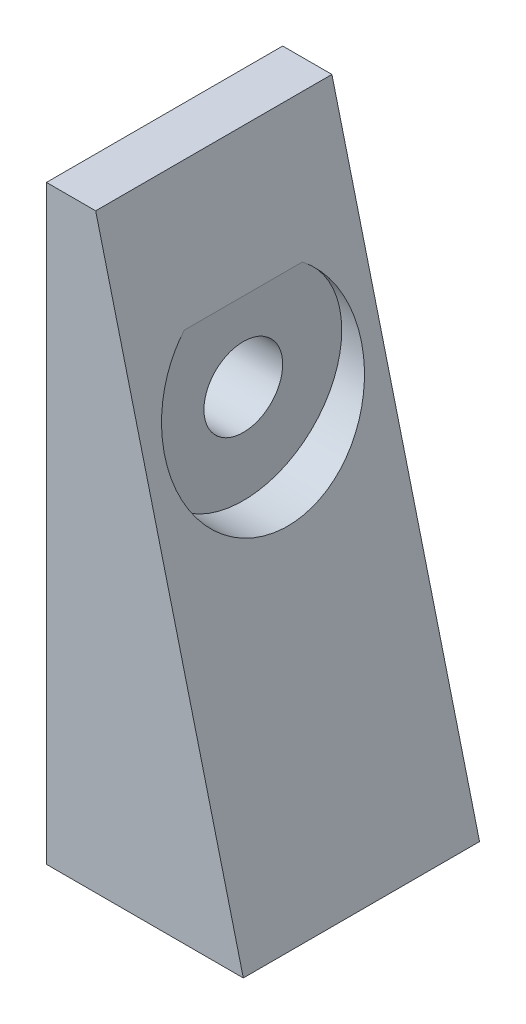
ISO-10303-21;
HEADER;
FILE_DESCRIPTION(('STEP AP214'),'2;1');
FILE_NAME('part.step','',(''),(''),'','','');
FILE_SCHEMA(('AUTOMOTIVE_DESIGN { 1 0 10303 214 1 1 1 1 }'));
ENDSEC;
DATA;
#1=APPLICATION_CONTEXT('core data for automotive mechanical design processes');
#2=APPLICATION_PROTOCOL_DEFINITION('international standard','automotive_design',2000,#1);
#3=PRODUCT_CONTEXT('',#1,'mechanical');
#4=PRODUCT('Part','Part','',(#3));
#5=PRODUCT_RELATED_PRODUCT_CATEGORY('part','',(#4));
#6=PRODUCT_DEFINITION_FORMATION('','',#4);
#7=PRODUCT_DEFINITION_CONTEXT('part definition',#1,'design');
#8=PRODUCT_DEFINITION('design','',#6,#7);
#9=PRODUCT_DEFINITION_SHAPE('','',#8);
#10=(LENGTH_UNIT() NAMED_UNIT(*) SI_UNIT(.MILLI.,.METRE.));
#11=(NAMED_UNIT(*) PLANE_ANGLE_UNIT() SI_UNIT($,.RADIAN.));
#12=(NAMED_UNIT(*) SI_UNIT($,.STERADIAN.) SOLID_ANGLE_UNIT());
#13=UNCERTAINTY_MEASURE_WITH_UNIT(LENGTH_MEASURE(1.E-05),#10,'distance_accuracy_value','');
#14=(GEOMETRIC_REPRESENTATION_CONTEXT(3) GLOBAL_UNCERTAINTY_ASSIGNED_CONTEXT((#13)) GLOBAL_UNIT_ASSIGNED_CONTEXT((#10,
#11,#12)) REPRESENTATION_CONTEXT('',''));
#15=CARTESIAN_POINT('',(0.,0.,0.));
#16=DIRECTION('',(0.,0.,1.));
#17=DIRECTION('',(1.,0.,0.));
#18=AXIS2_PLACEMENT_3D('',#15,#16,#17);
#19=CARTESIAN_POINT('',(10.,0.,6.));
#20=DIRECTION('',(0.,1.,0.));
#21=DIRECTION('',(-1.,0.,0.));
#22=AXIS2_PLACEMENT_3D('',#19,#20,#21);
#23=PLANE('',#22);
#24=DIRECTION('',(1.,0.,0.));
#25=VECTOR('',#24,1.);
#26=CARTESIAN_POINT('',(10.,0.,-6.));
#27=LINE('',#26,#25);
#28=CARTESIAN_POINT('',(0.,0.,-6.));
#29=VERTEX_POINT('',#28);
#30=CARTESIAN_POINT('',(10.,0.,-6.));
#31=VERTEX_POINT('',#30);
#32=EDGE_CURVE('E117',#29,#31,#27,.T.);
#33=ORIENTED_EDGE('',*,*,#32,.T.);
#34=DIRECTION('',(0.,0.,-1.));
#35=VECTOR('',#34,1.);
#36=CARTESIAN_POINT('',(10.,0.,6.));
#37=LINE('',#36,#35);
#38=CARTESIAN_POINT('',(10.,0.,6.));
#39=VERTEX_POINT('',#38);
#40=EDGE_CURVE('E48',#39,#31,#37,.T.);
#41=ORIENTED_EDGE('',*,*,#40,.F.);
#42=DIRECTION('',(1.,0.,0.));
#43=VECTOR('',#42,1.);
#44=CARTESIAN_POINT('',(10.,0.,6.));
#45=LINE('',#44,#43);
#46=CARTESIAN_POINT('',(0.,0.,6.));
#47=VERTEX_POINT('',#46);
#48=EDGE_CURVE('E126',#47,#39,#45,.T.);
#49=ORIENTED_EDGE('',*,*,#48,.F.);
#50=DIRECTION('',(0.,0.,-1.));
#51=VECTOR('',#50,1.);
#52=CARTESIAN_POINT('',(0.,0.,6.));
#53=LINE('',#52,#51);
#54=EDGE_CURVE('E130',#47,#29,#53,.T.);
#55=ORIENTED_EDGE('',*,*,#54,.T.);
#56=EDGE_LOOP('',(#33,#41,#49,#55));
#57=FACE_BOUND('',#56,.T.);
#58=ADVANCED_FACE('F41',(#57),#23,.F.);
#59=CARTESIAN_POINT('',(2.5,30.,6.));
#60=DIRECTION('',(-0.970142500145332,-0.242535625036333,0.));
#61=DIRECTION('',(0.242535625036333,-0.970142500145332,0.));
#62=AXIS2_PLACEMENT_3D('',#59,#60,#61);
#63=PLANE('',#62);
#64=DIRECTION('',(0.,0.,-1.));
#65=VECTOR('',#64,1.);
#66=CARTESIAN_POINT('',(4.,24.,6.));
#67=LINE('',#66,#65);
#68=CARTESIAN_POINT('',(4.,24.,3.));
#69=VERTEX_POINT('',#68);
#70=CARTESIAN_POINT('',(4.,24.,-3.));
#71=VERTEX_POINT('',#70);
#72=EDGE_CURVE('E95',#69,#71,#67,.T.);
#73=ORIENTED_EDGE('',*,*,#72,.T.);
#74=CARTESIAN_POINT('',(5.,20.,0.));
#75=DIRECTION('',(-0.970142500145332,-0.242535625036333,0.));
#76=DIRECTION('',(-0.242535625036333,0.970142500145332,0.));
#77=AXIS2_PLACEMENT_3D('',#74,#75,#76);
#78=ELLIPSE('',#77,5.15388203202208,5.);
#79=EDGE_CURVE('E11',#71,#69,#78,.T.);
#80=ORIENTED_EDGE('',*,*,#79,.T.);
#81=EDGE_LOOP('',(#73,#80));
#82=FACE_BOUND('',#81,.T.);
#83=DIRECTION('',(-0.242535625036333,0.970142500145332,0.));
#84=VECTOR('',#83,1.);
#85=CARTESIAN_POINT('',(2.5,30.,-6.));
#86=LINE('',#85,#84);
#87=CARTESIAN_POINT('',(2.5,30.,-6.));
#88=VERTEX_POINT('',#87);
#89=EDGE_CURVE('E107',#31,#88,#86,.T.);
#90=ORIENTED_EDGE('',*,*,#89,.T.);
#91=DIRECTION('',(0.,0.,-1.));
#92=VECTOR('',#91,1.);
#93=CARTESIAN_POINT('',(2.5,30.,6.));
#94=LINE('',#93,#92);
#95=CARTESIAN_POINT('',(2.5,30.,6.));
#96=VERTEX_POINT('',#95);
#97=EDGE_CURVE('E109',#96,#88,#94,.T.);
#98=ORIENTED_EDGE('',*,*,#97,.F.);
#99=DIRECTION('',(-0.242535625036333,0.970142500145332,0.));
#100=VECTOR('',#99,1.);
#101=CARTESIAN_POINT('',(2.5,30.,6.));
#102=LINE('',#101,#100);
#103=EDGE_CURVE('E92',#39,#96,#102,.T.);
#104=ORIENTED_EDGE('',*,*,#103,.F.);
#105=ORIENTED_EDGE('',*,*,#40,.T.);
#106=EDGE_LOOP('',(#90,#98,#104,#105));
#107=FACE_BOUND('',#106,.T.);
#108=ADVANCED_FACE('F104',(#82,#107),#63,.F.);
#109=CARTESIAN_POINT('',(0.,30.,6.));
#110=DIRECTION('',(0.,-1.,0.));
#111=DIRECTION('',(0.,0.,-1.));
#112=AXIS2_PLACEMENT_3D('',#109,#110,#111);
#113=PLANE('',#112);
#114=DIRECTION('',(-1.,0.,0.));
#115=VECTOR('',#114,1.);
#116=CARTESIAN_POINT('',(0.,30.,-6.));
#117=LINE('',#116,#115);
#118=CARTESIAN_POINT('',(0.,30.,-6.));
#119=VERTEX_POINT('',#118);
#120=EDGE_CURVE('E116',#88,#119,#117,.T.);
#121=ORIENTED_EDGE('',*,*,#120,.T.);
#122=DIRECTION('',(0.,0.,-1.));
#123=VECTOR('',#122,1.);
#124=CARTESIAN_POINT('',(0.,30.,6.));
#125=LINE('',#124,#123);
#126=CARTESIAN_POINT('',(0.,30.,6.));
#127=VERTEX_POINT('',#126);
#128=EDGE_CURVE('E122',#127,#119,#125,.T.);
#129=ORIENTED_EDGE('',*,*,#128,.F.);
#130=DIRECTION('',(-1.,0.,0.));
#131=VECTOR('',#130,1.);
#132=CARTESIAN_POINT('',(0.,30.,6.));
#133=LINE('',#132,#131);
#134=EDGE_CURVE('E121',#96,#127,#133,.T.);
#135=ORIENTED_EDGE('',*,*,#134,.F.);
#136=ORIENTED_EDGE('',*,*,#97,.T.);
#137=EDGE_LOOP('',(#121,#129,#135,#136));
#138=FACE_BOUND('',#137,.T.);
#139=ADVANCED_FACE('F106',(#138),#113,.F.);
#140=CARTESIAN_POINT('',(0.,0.,6.));
#141=DIRECTION('',(1.,0.,0.));
#142=DIRECTION('',(0.,0.,-1.));
#143=AXIS2_PLACEMENT_3D('',#140,#141,#142);
#144=PLANE('',#143);
#145=CARTESIAN_POINT('',(0.,20.,0.));
#146=DIRECTION('',(-1.,0.,0.));
#147=DIRECTION('',(0.,0.,1.));
#148=AXIS2_PLACEMENT_3D('',#145,#146,#147);
#149=CIRCLE('',#148,2.);
#150=CARTESIAN_POINT('',(0.,20.,2.));
#151=VERTEX_POINT('',#150);
#152=EDGE_CURVE('E98',#151,#151,#149,.T.);
#153=ORIENTED_EDGE('',*,*,#152,.F.);
#154=EDGE_LOOP('',(#153));
#155=FACE_BOUND('',#154,.T.);
#156=DIRECTION('',(0.,-1.,0.));
#157=VECTOR('',#156,1.);
#158=CARTESIAN_POINT('',(0.,0.,-6.));
#159=LINE('',#158,#157);
#160=EDGE_CURVE('E84',#119,#29,#159,.T.);
#161=ORIENTED_EDGE('',*,*,#160,.T.);
#162=ORIENTED_EDGE('',*,*,#54,.F.);
#163=DIRECTION('',(0.,-1.,0.));
#164=VECTOR('',#163,1.);
#165=CARTESIAN_POINT('',(0.,0.,6.));
#166=LINE('',#165,#164);
#167=EDGE_CURVE('E63',#127,#47,#166,.T.);
#168=ORIENTED_EDGE('',*,*,#167,.F.);
#169=ORIENTED_EDGE('',*,*,#128,.T.);
#170=EDGE_LOOP('',(#161,#162,#168,#169));
#171=FACE_BOUND('',#170,.T.);
#172=ADVANCED_FACE('F158',(#155,#171),#144,.F.);
#173=CARTESIAN_POINT('',(0.,0.,6.));
#174=DIRECTION('',(0.,0.,-1.));
#175=DIRECTION('',(-1.,0.,0.));
#176=AXIS2_PLACEMENT_3D('',#173,#174,#175);
#177=PLANE('',#176);
#178=ORIENTED_EDGE('',*,*,#48,.T.);
#179=ORIENTED_EDGE('',*,*,#103,.T.);
#180=ORIENTED_EDGE('',*,*,#134,.T.);
#181=ORIENTED_EDGE('',*,*,#167,.T.);
#182=EDGE_LOOP('',(#178,#179,#180,#181));
#183=FACE_BOUND('',#182,.T.);
#184=ADVANCED_FACE('F157',(#183),#177,.F.);
#185=CARTESIAN_POINT('',(0.,0.,-6.));
#186=DIRECTION('',(0.,0.,-1.));
#187=DIRECTION('',(-1.,0.,0.));
#188=AXIS2_PLACEMENT_3D('',#185,#186,#187);
#189=PLANE('',#188);
#190=ORIENTED_EDGE('',*,*,#32,.F.);
#191=ORIENTED_EDGE('',*,*,#160,.F.);
#192=ORIENTED_EDGE('',*,*,#120,.F.);
#193=ORIENTED_EDGE('',*,*,#89,.F.);
#194=EDGE_LOOP('',(#190,#191,#192,#193));
#195=FACE_BOUND('',#194,.T.);
#196=ADVANCED_FACE('F124',(#195),#189,.T.);
#197=CARTESIAN_POINT('',(10.,20.,0.));
#198=DIRECTION('',(-1.,0.,0.));
#199=DIRECTION('',(0.,0.,1.));
#200=AXIS2_PLACEMENT_3D('',#197,#198,#199);
#201=CYLINDRICAL_SURFACE('',#200,2.);
#202=CARTESIAN_POINT('',(4.,20.,0.));
#203=DIRECTION('',(-1.,0.,0.));
#204=DIRECTION('',(0.,0.,1.));
#205=AXIS2_PLACEMENT_3D('',#202,#203,#204);
#206=CIRCLE('',#205,2.);
#207=CARTESIAN_POINT('',(4.,20.,2.));
#208=VERTEX_POINT('',#207);
#209=EDGE_CURVE('E99',#208,#208,#206,.F.);
#210=ORIENTED_EDGE('',*,*,#209,.T.);
#211=EDGE_LOOP('',(#210));
#212=FACE_BOUND('',#211,.T.);
#213=ORIENTED_EDGE('',*,*,#152,.T.);
#214=EDGE_LOOP('',(#213));
#215=FACE_BOUND('',#214,.T.);
#216=ADVANCED_FACE('F136',(#212,#215),#201,.F.);
#217=CARTESIAN_POINT('',(10.,20.,0.));
#218=DIRECTION('',(-1.,0.,0.));
#219=DIRECTION('',(0.,0.,1.));
#220=AXIS2_PLACEMENT_3D('',#217,#218,#219);
#221=CYLINDRICAL_SURFACE('',#220,5.);
#222=CARTESIAN_POINT('',(4.,20.,0.));
#223=DIRECTION('',(-1.,0.,0.));
#224=DIRECTION('',(0.,0.,1.));
#225=AXIS2_PLACEMENT_3D('',#222,#223,#224);
#226=CIRCLE('',#225,5.);
#227=EDGE_CURVE('E54',#71,#69,#226,.T.);
#228=ORIENTED_EDGE('',*,*,#227,.T.);
#229=ORIENTED_EDGE('',*,*,#79,.F.);
#230=EDGE_LOOP('',(#228,#229));
#231=FACE_BOUND('',#230,.T.);
#232=ADVANCED_FACE('F102',(#231),#221,.F.);
#233=CARTESIAN_POINT('',(4.,20.,0.));
#234=DIRECTION('',(-1.,0.,0.));
#235=DIRECTION('',(0.,0.,1.));
#236=AXIS2_PLACEMENT_3D('',#233,#234,#235);
#237=PLANE('',#236);
#238=ORIENTED_EDGE('',*,*,#209,.F.);
#239=EDGE_LOOP('',(#238));
#240=FACE_BOUND('',#239,.T.);
#241=ORIENTED_EDGE('',*,*,#227,.F.);
#242=ORIENTED_EDGE('',*,*,#72,.F.);
#243=EDGE_LOOP('',(#241,#242));
#244=FACE_BOUND('',#243,.T.);
#245=ADVANCED_FACE('F96',(#240,#244),#237,.F.);
#246=CLOSED_SHELL('',(#58,#108,#139,#172,#184,#196,#216,#232,#245));
#247=MANIFOLD_SOLID_BREP('B2',#246);
#248=ADVANCED_BREP_SHAPE_REPRESENTATION('',(#18,#247),#14);
#249=SHAPE_DEFINITION_REPRESENTATION(#9,#248);
ENDSEC;
END-ISO-10303-21;
